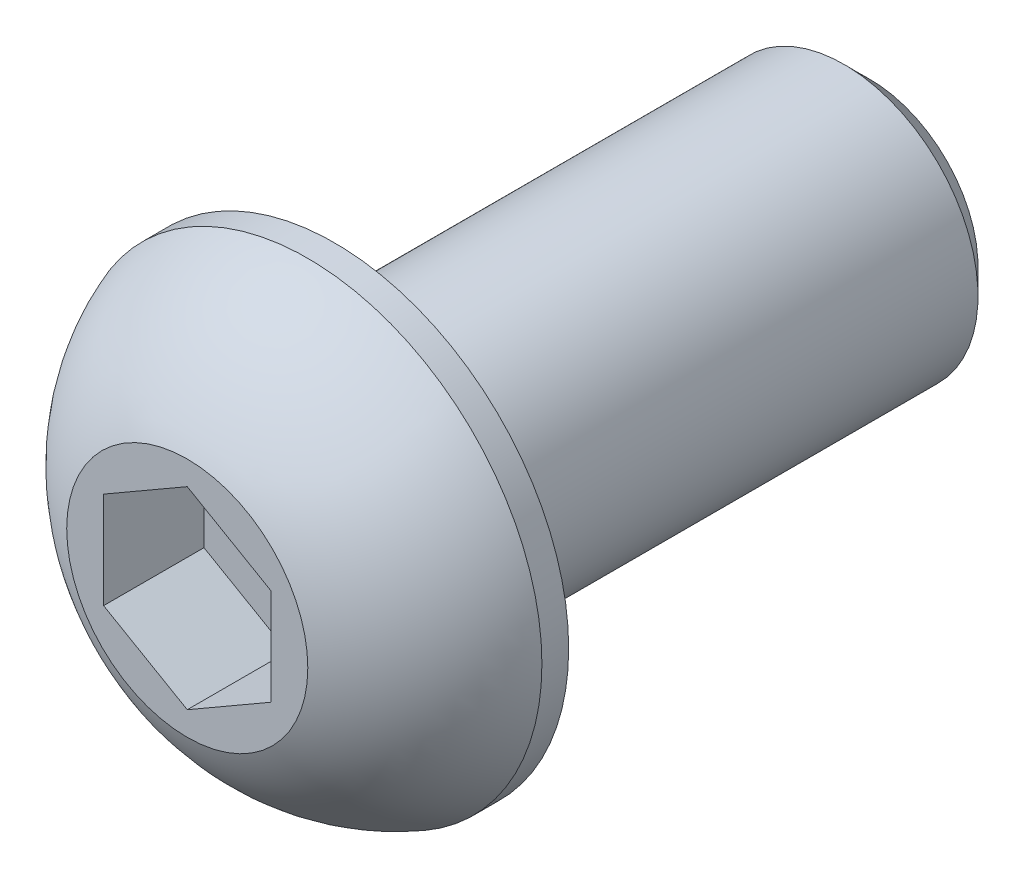
ISO-10303-21;
HEADER;
FILE_DESCRIPTION(('STEP AP214'),'2;1');
FILE_NAME('part.step','',(''),(''),'','','');
FILE_SCHEMA(('AUTOMOTIVE_DESIGN { 1 0 10303 214 1 1 1 1 }'));
ENDSEC;
DATA;
#1=APPLICATION_CONTEXT('core data for automotive mechanical design processes');
#2=APPLICATION_PROTOCOL_DEFINITION('international standard','automotive_design',2000,#1);
#3=PRODUCT_CONTEXT('',#1,'mechanical');
#4=PRODUCT('Part','Part','',(#3));
#5=PRODUCT_RELATED_PRODUCT_CATEGORY('part','',(#4));
#6=PRODUCT_DEFINITION_FORMATION('','',#4);
#7=PRODUCT_DEFINITION_CONTEXT('part definition',#1,'design');
#8=PRODUCT_DEFINITION('design','',#6,#7);
#9=PRODUCT_DEFINITION_SHAPE('','',#8);
#10=(LENGTH_UNIT() NAMED_UNIT(*) SI_UNIT(.MILLI.,.METRE.));
#11=(NAMED_UNIT(*) PLANE_ANGLE_UNIT() SI_UNIT($,.RADIAN.));
#12=(NAMED_UNIT(*) SI_UNIT($,.STERADIAN.) SOLID_ANGLE_UNIT());
#13=UNCERTAINTY_MEASURE_WITH_UNIT(LENGTH_MEASURE(1.E-05),#10,'distance_accuracy_value','');
#14=(GEOMETRIC_REPRESENTATION_CONTEXT(3) GLOBAL_UNCERTAINTY_ASSIGNED_CONTEXT((#13)) GLOBAL_UNIT_ASSIGNED_CONTEXT((#10,
#11,#12)) REPRESENTATION_CONTEXT('',''));
#15=CARTESIAN_POINT('',(0.,0.,0.));
#16=DIRECTION('',(0.,0.,1.));
#17=DIRECTION('',(1.,0.,0.));
#18=AXIS2_PLACEMENT_3D('',#15,#16,#17);
#19=CARTESIAN_POINT('',(-1.11022302462516E-13,0.,0.400000000009865));
#20=DIRECTION('',(0.,0.,0.999999999999999));
#21=DIRECTION('',(-1.,0.,0.));
#22=AXIS2_PLACEMENT_3D('',#19,#20,#21);
#23=CYLINDRICAL_SURFACE('',#22,7.00000000000321);
#24=CARTESIAN_POINT('',(0.,0.,0.800000000019715));
#25=DIRECTION('',(0.,0.,-0.999999999999999));
#26=DIRECTION('',(-1.,0.,0.));
#27=AXIS2_PLACEMENT_3D('',#24,#25,#26);
#28=CIRCLE('',#27,7.00000000000641);
#29=CARTESIAN_POINT('',(-7.00000000000661,-1.55431223447522E-12,0.80000000001966));
#30=VERTEX_POINT('',#29);
#31=EDGE_CURVE('E11',#30,#30,#28,.T.);
#32=ORIENTED_EDGE('',*,*,#31,.T.);
#33=EDGE_LOOP('',(#32));
#34=FACE_BOUND('',#33,.T.);
#35=CARTESIAN_POINT('',(0.,0.,0.));
#36=DIRECTION('',(0.,0.,-0.999999999999999));
#37=DIRECTION('',(-1.,0.,0.));
#38=AXIS2_PLACEMENT_3D('',#35,#36,#37);
#39=CIRCLE('',#38,7.);
#40=CARTESIAN_POINT('',(-6.99999999999995,-9.99200722162641E-13,0.));
#41=VERTEX_POINT('',#40);
#42=EDGE_CURVE('E136',#41,#41,#39,.T.);
#43=ORIENTED_EDGE('',*,*,#42,.F.);
#44=EDGE_LOOP('',(#43));
#45=FACE_BOUND('',#44,.T.);
#46=ADVANCED_FACE('F16',(#34,#45),#23,.T.);
#47=CARTESIAN_POINT('',(0.,1.11022302462516E-13,-1.33666273509482));
#48=DIRECTION('',(0.,0.,-0.999999999999999));
#49=DIRECTION('',(0.,-1.,0.));
#50=AXIS2_PLACEMENT_3D('',#47,#48,#49);
#51=DEGENERATE_TOROIDAL_SURFACE('',#50,1.12956738217048,6.24718390670383,.T.);
#52=CARTESIAN_POINT('',(1.66533453693773E-13,-1.11022302462516E-13,4.3999999999999));
#53=DIRECTION('',(0.,0.,-0.999999999999999));
#54=DIRECTION('',(-1.,0.,0.));
#55=AXIS2_PLACEMENT_3D('',#52,#53,#54);
#56=CIRCLE('',#55,3.603028);
#57=CARTESIAN_POINT('',(-3.60302799999956,-1.55431223447522E-12,4.39999999999996));
#58=VERTEX_POINT('',#57);
#59=EDGE_CURVE('E27',#58,#58,#56,.T.);
#60=ORIENTED_EDGE('',*,*,#59,.T.);
#61=EDGE_LOOP('',(#60));
#62=FACE_BOUND('',#61,.T.);
#63=ORIENTED_EDGE('',*,*,#31,.F.);
#64=EDGE_LOOP('',(#63));
#65=FACE_BOUND('',#64,.T.);
#66=ADVANCED_FACE('F199',(#62,#65),#51,.T.);
#67=CARTESIAN_POINT('',(-3.23151400000005,-2.22044604925031E-13,4.39999999999988));
#68=DIRECTION('',(0.,0.,0.999999999999999));
#69=DIRECTION('',(1.,0.,0.));
#70=AXIS2_PLACEMENT_3D('',#67,#68,#69);
#71=PLANE('',#70);
#72=ORIENTED_EDGE('',*,*,#59,.F.);
#73=EDGE_LOOP('',(#72));
#74=FACE_BOUND('',#73,.T.);
#75=DIRECTION('',(0.,-1.,0.));
#76=VECTOR('',#75,1.);
#77=CARTESIAN_POINT('',(2.49999999999961,0.360843918249754,4.4));
#78=LINE('',#77,#76);
#79=CARTESIAN_POINT('',(2.50000000000045,1.44337567299924,4.39999999999988));
#80=VERTEX_POINT('',#79);
#81=CARTESIAN_POINT('',(2.49999999999978,-1.44337567300112,4.39999999999989));
#82=VERTEX_POINT('',#81);
#83=EDGE_CURVE('E127',#80,#82,#78,.T.);
#84=ORIENTED_EDGE('',*,*,#83,.T.);
#85=DIRECTION('',(-0.866025403795551,-0.49999999998076,0.));
#86=VECTOR('',#85,1.);
#87=CARTESIAN_POINT('',(0.0381822499425644,-2.86470681361917,4.3999999999999));
#88=LINE('',#87,#86);
#89=CARTESIAN_POINT('',(0.,-2.88675134590011,4.3999999999999));
#90=VERTEX_POINT('',#89);
#91=EDGE_CURVE('E147',#82,#90,#88,.T.);
#92=ORIENTED_EDGE('',*,*,#91,.T.);
#93=DIRECTION('',(-0.86602540379555,0.499999999980759,0.));
#94=VECTOR('',#93,1.);
#95=CARTESIAN_POINT('',(-2.46181775000448,-1.46542020531271,4.39999999999996));
#96=LINE('',#95,#94);
#97=CARTESIAN_POINT('',(-2.50000000000072,-1.44337567300068,4.39999999999986));
#98=VERTEX_POINT('',#97);
#99=EDGE_CURVE('E151',#90,#98,#96,.T.);
#100=ORIENTED_EDGE('',*,*,#99,.T.);
#101=DIRECTION('',(0.,1.,0.));
#102=VECTOR('',#101,1.);
#103=CARTESIAN_POINT('',(-2.49999999999972,-2.22044604925031E-13,4.39999999999995));
#104=LINE('',#103,#102);
#105=CARTESIAN_POINT('',(-2.50000000000011,1.4433756729999,4.3999999999999));
#106=VERTEX_POINT('',#105);
#107=EDGE_CURVE('E79',#98,#106,#104,.T.);
#108=ORIENTED_EDGE('',*,*,#107,.T.);
#109=DIRECTION('',(0.866025403795551,0.49999999998076,0.));
#110=VECTOR('',#109,1.);
#111=CARTESIAN_POINT('',(-2.46181775000498,1.46542020531126,4.39999999999986));
#112=LINE('',#111,#110);
#113=CARTESIAN_POINT('',(0.,2.88675134589877,4.3999999999999));
#114=VERTEX_POINT('',#113);
#115=EDGE_CURVE('E106',#106,#114,#112,.T.);
#116=ORIENTED_EDGE('',*,*,#115,.T.);
#117=DIRECTION('',(0.86602540379555,-0.499999999980759,0.));
#118=VECTOR('',#117,1.);
#119=CARTESIAN_POINT('',(0.0381822499423423,2.86470681361839,4.39999999999985));
#120=LINE('',#119,#118);
#121=EDGE_CURVE('E112',#114,#80,#120,.T.);
#122=ORIENTED_EDGE('',*,*,#121,.T.);
#123=EDGE_LOOP('',(#84,#92,#100,#108,#116,#122));
#124=FACE_BOUND('',#123,.T.);
#125=ADVANCED_FACE('F204',(#74,#124),#71,.T.);
#126=CARTESIAN_POINT('',(-1.61660000000013,-2.22044604925031E-13,-16.0000000000001));
#127=DIRECTION('',(0.,0.,-0.999999999999999));
#128=DIRECTION('',(-1.,0.,0.));
#129=AXIS2_PLACEMENT_3D('',#126,#127,#128);
#130=PLANE('',#129);
#131=CARTESIAN_POINT('',(-1.66533453693773E-13,-2.22044604925031E-13,-15.9999999999999));
#132=DIRECTION('',(0.,0.,-0.999999999999999));
#133=DIRECTION('',(-1.,0.,0.));
#134=AXIS2_PLACEMENT_3D('',#131,#132,#133);
#135=CIRCLE('',#134,3.2332);
#136=CARTESIAN_POINT('',(-3.23320000000055,-9.99200722162641E-13,-16.));
#137=VERTEX_POINT('',#136);
#138=EDGE_CURVE('E168',#137,#137,#135,.T.);
#139=ORIENTED_EDGE('',*,*,#138,.T.);
#140=EDGE_LOOP('',(#139));
#141=FACE_BOUND('',#140,.T.);
#142=ADVANCED_FACE('F196',(#141),#130,.T.);
#143=CARTESIAN_POINT('',(0.,0.,-15.6165999999999));
#144=DIRECTION('',(0.,0.,0.999999999999999));
#145=DIRECTION('',(-1.,0.,0.));
#146=AXIS2_PLACEMENT_3D('',#143,#144,#145);
#147=CONICAL_SURFACE('',#146,3.6166,0.785398163397448);
#148=CARTESIAN_POINT('',(-1.11022302462516E-13,-2.22044604925031E-13,-15.2332));
#149=DIRECTION('',(0.,0.,-0.999999999999999));
#150=DIRECTION('',(-1.,0.,0.));
#151=AXIS2_PLACEMENT_3D('',#148,#149,#150);
#152=CIRCLE('',#151,4.);
#153=CARTESIAN_POINT('',(-3.99999999999984,0.,-15.2332000000001));
#154=VERTEX_POINT('',#153);
#155=EDGE_CURVE('E167',#154,#154,#152,.T.);
#156=ORIENTED_EDGE('',*,*,#155,.T.);
#157=EDGE_LOOP('',(#156));
#158=FACE_BOUND('',#157,.T.);
#159=ORIENTED_EDGE('',*,*,#138,.F.);
#160=EDGE_LOOP('',(#159));
#161=FACE_BOUND('',#160,.T.);
#162=ADVANCED_FACE('F182',(#158,#161),#147,.T.);
#163=CARTESIAN_POINT('',(1.66533453693773E-13,1.11022302462516E-13,-7.8166000000001));
#164=DIRECTION('',(0.,0.,0.999999999999999));
#165=DIRECTION('',(-1.,0.,0.));
#166=AXIS2_PLACEMENT_3D('',#163,#164,#165);
#167=CYLINDRICAL_SURFACE('',#166,4.);
#168=CARTESIAN_POINT('',(0.,1.11022302462516E-13,-0.399999999999984));
#169=DIRECTION('',(0.,0.,-0.999999999999999));
#170=DIRECTION('',(-1.,0.,0.));
#171=AXIS2_PLACEMENT_3D('',#168,#169,#170);
#172=CIRCLE('',#171,4.);
#173=CARTESIAN_POINT('',(-4.00000000000017,0.,-0.400000000000067));
#174=VERTEX_POINT('',#173);
#175=EDGE_CURVE('E140',#174,#174,#172,.T.);
#176=ORIENTED_EDGE('',*,*,#175,.T.);
#177=EDGE_LOOP('',(#176));
#178=FACE_BOUND('',#177,.T.);
#179=ORIENTED_EDGE('',*,*,#155,.F.);
#180=EDGE_LOOP('',(#179));
#181=FACE_BOUND('',#180,.T.);
#182=ADVANCED_FACE('F18',(#178,#181),#167,.T.);
#183=CARTESIAN_POINT('',(0.,1.11022302462516E-13,-0.399999999999984));
#184=DIRECTION('',(0.,0.,-0.999999999999999));
#185=DIRECTION('',(0.,-1.,0.));
#186=AXIS2_PLACEMENT_3D('',#183,#184,#185);
#187=TOROIDAL_SURFACE('',#186,4.4,0.4);
#188=CARTESIAN_POINT('',(0.,0.,0.));
#189=DIRECTION('',(0.,0.,-0.999999999999999));
#190=DIRECTION('',(-1.,0.,0.));
#191=AXIS2_PLACEMENT_3D('',#188,#189,#190);
#192=CIRCLE('',#191,4.4);
#193=CARTESIAN_POINT('',(-4.40000000000035,-8.88178419700125E-13,-1.2490009027033E-13));
#194=VERTEX_POINT('',#193);
#195=EDGE_CURVE('E141',#194,#194,#192,.T.);
#196=ORIENTED_EDGE('',*,*,#195,.T.);
#197=EDGE_LOOP('',(#196));
#198=FACE_BOUND('',#197,.T.);
#199=ORIENTED_EDGE('',*,*,#175,.F.);
#200=EDGE_LOOP('',(#199));
#201=FACE_BOUND('',#200,.T.);
#202=ADVANCED_FACE('F186',(#198,#201),#187,.F.);
#203=CARTESIAN_POINT('',(-5.70000000000021,-3.33066907387547E-13,-1.2490009027033E-13));
#204=DIRECTION('',(0.,0.,-0.999999999999999));
#205=DIRECTION('',(-1.,0.,0.));
#206=AXIS2_PLACEMENT_3D('',#203,#204,#205);
#207=PLANE('',#206);
#208=ORIENTED_EDGE('',*,*,#42,.T.);
#209=EDGE_LOOP('',(#208));
#210=FACE_BOUND('',#209,.T.);
#211=ORIENTED_EDGE('',*,*,#195,.F.);
#212=EDGE_LOOP('',(#211));
#213=FACE_BOUND('',#212,.T.);
#214=ADVANCED_FACE('F193',(#210,#213),#207,.T.);
#215=CARTESIAN_POINT('',(-1.66533453693773E-13,-1.11022302462516E-13,1.39999999999997));
#216=DIRECTION('',(0.,0.,-0.999999999999999));
#217=DIRECTION('',(1.,0.,0.));
#218=AXIS2_PLACEMENT_3D('',#215,#216,#217);
#219=PLANE('',#218);
#220=DIRECTION('',(0.,1.00000000000001,0.));
#221=VECTOR('',#220,1.);
#222=CARTESIAN_POINT('',(2.50000000000006,-2.22044604925031E-13,1.40000000000004));
#223=LINE('',#222,#221);
#224=CARTESIAN_POINT('',(2.49999999999989,-1.44337567300112,1.40000000000005));
#225=VERTEX_POINT('',#224);
#226=CARTESIAN_POINT('',(2.50000000000056,1.44337567299935,1.40000000000003));
#227=VERTEX_POINT('',#226);
#228=EDGE_CURVE('E118',#225,#227,#223,.T.);
#229=ORIENTED_EDGE('',*,*,#228,.T.);
#230=DIRECTION('',(-0.866025403795551,0.499999999980759,0.));
#231=VECTOR('',#230,1.);
#232=CARTESIAN_POINT('',(0.,2.886751345899,1.3999999999999));
#233=LINE('',#232,#231);
#234=CARTESIAN_POINT('',(0.,2.886751345899,1.3999999999999));
#235=VERTEX_POINT('',#234);
#236=EDGE_CURVE('E110',#227,#235,#233,.T.);
#237=ORIENTED_EDGE('',*,*,#236,.T.);
#238=DIRECTION('',(-0.866025403795552,-0.49999999998076,0.));
#239=VECTOR('',#238,1.);
#240=CARTESIAN_POINT('',(-2.50000000000011,1.44337567299957,1.40000000000001));
#241=LINE('',#240,#239);
#242=CARTESIAN_POINT('',(-2.50000000000011,1.44337567299957,1.40000000000001));
#243=VERTEX_POINT('',#242);
#244=EDGE_CURVE('E20',#235,#243,#241,.T.);
#245=ORIENTED_EDGE('',*,*,#244,.T.);
#246=DIRECTION('',(0.,-1.00000000000001,0.));
#247=VECTOR('',#246,1.);
#248=CARTESIAN_POINT('',(-2.50000000000083,-1.4433756730009,1.39999999999997));
#249=LINE('',#248,#247);
#250=CARTESIAN_POINT('',(-2.50000000000083,-1.4433756730009,1.39999999999997));
#251=VERTEX_POINT('',#250);
#252=EDGE_CURVE('E157',#243,#251,#249,.T.);
#253=ORIENTED_EDGE('',*,*,#252,.T.);
#254=DIRECTION('',(0.866025403795551,-0.499999999980759,0.));
#255=VECTOR('',#254,1.);
#256=CARTESIAN_POINT('',(2.77555756156289E-13,-2.88675134590044,1.40000000000003));
#257=LINE('',#256,#255);
#258=CARTESIAN_POINT('',(2.77555756156289E-13,-2.88675134590044,1.40000000000003));
#259=VERTEX_POINT('',#258);
#260=EDGE_CURVE('E71',#251,#259,#257,.T.);
#261=ORIENTED_EDGE('',*,*,#260,.T.);
#262=DIRECTION('',(0.866025403795552,0.49999999998076,0.));
#263=VECTOR('',#262,1.);
#264=CARTESIAN_POINT('',(2.49999999999989,-1.44337567300112,1.40000000000005));
#265=LINE('',#264,#263);
#266=EDGE_CURVE('E144',#259,#225,#265,.T.);
#267=ORIENTED_EDGE('',*,*,#266,.T.);
#268=EDGE_LOOP('',(#229,#237,#245,#253,#261,#267));
#269=FACE_BOUND('',#268,.T.);
#270=ADVANCED_FACE('F116',(#269),#219,.F.);
#271=CARTESIAN_POINT('',(1.24999999999981,-2.16506350945023,4.39999999999992));
#272=DIRECTION('',(0.499999999980758,-0.866025403795552,0.));
#273=DIRECTION('',(-0.866025403795552,-0.49999999998076,0.));
#274=AXIS2_PLACEMENT_3D('',#271,#272,#273);
#275=PLANE('',#274);
#276=ORIENTED_EDGE('',*,*,#266,.F.);
#277=DIRECTION('',(0.,0.,-0.999999999999999));
#278=VECTOR('',#277,1.);
#279=CARTESIAN_POINT('',(0.,-2.88675134590011,4.3999999999999));
#280=LINE('',#279,#278);
#281=EDGE_CURVE('E148',#90,#259,#280,.T.);
#282=ORIENTED_EDGE('',*,*,#281,.F.);
#283=ORIENTED_EDGE('',*,*,#91,.F.);
#284=DIRECTION('',(0.,0.,-0.999999999999999));
#285=VECTOR('',#284,1.);
#286=CARTESIAN_POINT('',(2.49999999999978,-1.44337567300112,4.39999999999989));
#287=LINE('',#286,#285);
#288=EDGE_CURVE('E132',#82,#225,#287,.T.);
#289=ORIENTED_EDGE('',*,*,#288,.T.);
#290=EDGE_LOOP('',(#276,#282,#283,#289));
#291=FACE_BOUND('',#290,.T.);
#292=ADVANCED_FACE('F216',(#291),#275,.F.);
#293=CARTESIAN_POINT('',(-1.25000000000008,-2.16506350945156,4.39999999999992));
#294=DIRECTION('',(-0.499999999980759,-0.866025403795553,0.));
#295=DIRECTION('',(-0.866025403795551,0.499999999980759,0.));
#296=AXIS2_PLACEMENT_3D('',#293,#294,#295);
#297=PLANE('',#296);
#298=ORIENTED_EDGE('',*,*,#260,.F.);
#299=DIRECTION('',(0.,0.,-0.999999999999999));
#300=VECTOR('',#299,1.);
#301=CARTESIAN_POINT('',(-2.50000000000072,-1.44337567300068,4.39999999999986));
#302=LINE('',#301,#300);
#303=EDGE_CURVE('E156',#98,#251,#302,.T.);
#304=ORIENTED_EDGE('',*,*,#303,.F.);
#305=ORIENTED_EDGE('',*,*,#99,.F.);
#306=ORIENTED_EDGE('',*,*,#281,.T.);
#307=EDGE_LOOP('',(#298,#304,#305,#306));
#308=FACE_BOUND('',#307,.T.);
#309=ADVANCED_FACE('F226',(#308),#297,.F.);
#310=CARTESIAN_POINT('',(-2.49999999999972,-2.22044604925031E-13,4.39999999999995));
#311=DIRECTION('',(-1.,0.,0.));
#312=DIRECTION('',(0.,1.00000000000001,0.));
#313=AXIS2_PLACEMENT_3D('',#310,#311,#312);
#314=PLANE('',#313);
#315=ORIENTED_EDGE('',*,*,#252,.F.);
#316=DIRECTION('',(0.,0.,-0.999999999999999));
#317=VECTOR('',#316,1.);
#318=CARTESIAN_POINT('',(-2.50000000000011,1.4433756729999,4.3999999999999));
#319=LINE('',#318,#317);
#320=EDGE_CURVE('E101',#106,#243,#319,.T.);
#321=ORIENTED_EDGE('',*,*,#320,.F.);
#322=ORIENTED_EDGE('',*,*,#107,.F.);
#323=ORIENTED_EDGE('',*,*,#303,.T.);
#324=EDGE_LOOP('',(#315,#321,#322,#323));
#325=FACE_BOUND('',#324,.T.);
#326=ADVANCED_FACE('F234',(#325),#314,.F.);
#327=CARTESIAN_POINT('',(-1.2499999999997,2.16506350944923,4.39999999999989));
#328=DIRECTION('',(-0.499999999980758,0.866025403795552,0.));
#329=DIRECTION('',(0.866025403795552,0.49999999998076,0.));
#330=AXIS2_PLACEMENT_3D('',#327,#328,#329);
#331=PLANE('',#330);
#332=ORIENTED_EDGE('',*,*,#244,.F.);
#333=DIRECTION('',(0.,0.,-0.999999999999999));
#334=VECTOR('',#333,1.);
#335=CARTESIAN_POINT('',(0.,2.88675134589877,4.3999999999999));
#336=LINE('',#335,#334);
#337=EDGE_CURVE('E99',#114,#235,#336,.T.);
#338=ORIENTED_EDGE('',*,*,#337,.F.);
#339=ORIENTED_EDGE('',*,*,#115,.F.);
#340=ORIENTED_EDGE('',*,*,#320,.T.);
#341=EDGE_LOOP('',(#332,#338,#339,#340));
#342=FACE_BOUND('',#341,.T.);
#343=ADVANCED_FACE('F97',(#342),#331,.F.);
#344=CARTESIAN_POINT('',(1.24999999999936,2.16506350944923,4.39999999999992));
#345=DIRECTION('',(0.499999999980759,0.866025403795553,0.));
#346=DIRECTION('',(0.866025403795551,-0.499999999980759,0.));
#347=AXIS2_PLACEMENT_3D('',#344,#345,#346);
#348=PLANE('',#347);
#349=ORIENTED_EDGE('',*,*,#236,.F.);
#350=DIRECTION('',(0.,0.,-0.999999999999999));
#351=VECTOR('',#350,1.);
#352=CARTESIAN_POINT('',(2.50000000000045,1.44337567299924,4.39999999999988));
#353=LINE('',#352,#351);
#354=EDGE_CURVE('E120',#80,#227,#353,.T.);
#355=ORIENTED_EDGE('',*,*,#354,.F.);
#356=ORIENTED_EDGE('',*,*,#121,.F.);
#357=ORIENTED_EDGE('',*,*,#337,.T.);
#358=EDGE_LOOP('',(#349,#355,#356,#357));
#359=FACE_BOUND('',#358,.T.);
#360=ADVANCED_FACE('F108',(#359),#348,.F.);
#361=CARTESIAN_POINT('',(2.50000000000083,0.721687836499285,4.39999999999989));
#362=DIRECTION('',(1.,0.,0.));
#363=DIRECTION('',(0.,-1.00000000000001,0.));
#364=AXIS2_PLACEMENT_3D('',#361,#362,#363);
#365=PLANE('',#364);
#366=ORIENTED_EDGE('',*,*,#228,.F.);
#367=ORIENTED_EDGE('',*,*,#288,.F.);
#368=ORIENTED_EDGE('',*,*,#83,.F.);
#369=ORIENTED_EDGE('',*,*,#354,.T.);
#370=EDGE_LOOP('',(#366,#367,#368,#369));
#371=FACE_BOUND('',#370,.T.);
#372=ADVANCED_FACE('F209',(#371),#365,.F.);
#373=CLOSED_SHELL('',(#46,#66,#125,#142,#162,#182,#202,#214,#270,#292,#309,#326,#343,#360,#372));
#374=MANIFOLD_SOLID_BREP('B1',#373);
#375=ADVANCED_BREP_SHAPE_REPRESENTATION('',(#18,#374),#14);
#376=SHAPE_DEFINITION_REPRESENTATION(#9,#375);
ENDSEC;
END-ISO-10303-21;
